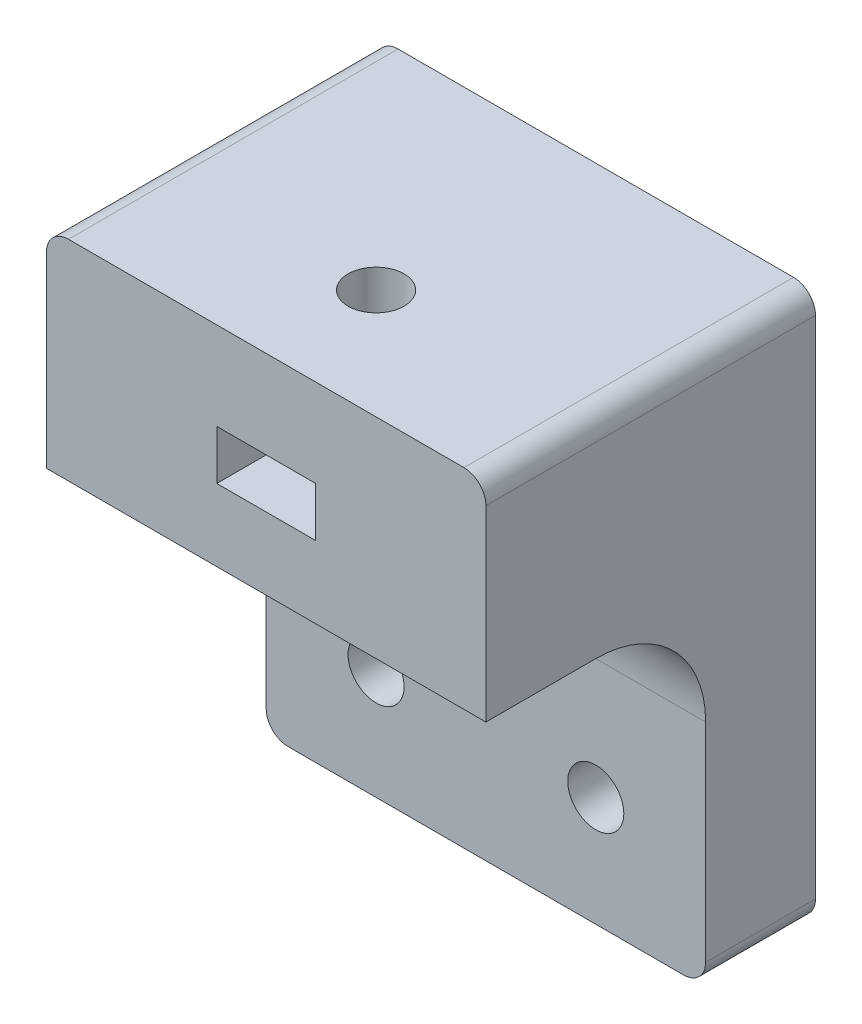
ISO-10303-21;
HEADER;
FILE_DESCRIPTION(('STEP AP214'),'2;1');
FILE_NAME('part.step','',(''),(''),'','','');
FILE_SCHEMA(('AUTOMOTIVE_DESIGN { 1 0 10303 214 1 1 1 1 }'));
ENDSEC;
DATA;
#1=APPLICATION_CONTEXT('core data for automotive mechanical design processes');
#2=APPLICATION_PROTOCOL_DEFINITION('international standard','automotive_design',2000,#1);
#3=PRODUCT_CONTEXT('',#1,'mechanical');
#4=PRODUCT('Part','Part','',(#3));
#5=PRODUCT_RELATED_PRODUCT_CATEGORY('part','',(#4));
#6=PRODUCT_DEFINITION_FORMATION('','',#4);
#7=PRODUCT_DEFINITION_CONTEXT('part definition',#1,'design');
#8=PRODUCT_DEFINITION('design','',#6,#7);
#9=PRODUCT_DEFINITION_SHAPE('','',#8);
#10=(LENGTH_UNIT() NAMED_UNIT(*) SI_UNIT(.MILLI.,.METRE.));
#11=(NAMED_UNIT(*) PLANE_ANGLE_UNIT() SI_UNIT($,.RADIAN.));
#12=(NAMED_UNIT(*) SI_UNIT($,.STERADIAN.) SOLID_ANGLE_UNIT());
#13=UNCERTAINTY_MEASURE_WITH_UNIT(LENGTH_MEASURE(1.E-05),#10,'distance_accuracy_value','');
#14=(GEOMETRIC_REPRESENTATION_CONTEXT(3) GLOBAL_UNCERTAINTY_ASSIGNED_CONTEXT((#13)) GLOBAL_UNIT_ASSIGNED_CONTEXT((#10,
#11,#12)) REPRESENTATION_CONTEXT('',''));
#15=CARTESIAN_POINT('',(0.,0.,0.));
#16=DIRECTION('',(0.,0.,1.));
#17=DIRECTION('',(1.,0.,0.));
#18=AXIS2_PLACEMENT_3D('',#15,#16,#17);
#19=CARTESIAN_POINT('',(5.13513513513512,0.,3.24324324324328));
#20=DIRECTION('',(0.,1.,0.));
#21=DIRECTION('',(0.,0.,1.));
#22=AXIS2_PLACEMENT_3D('',#19,#20,#21);
#23=CYLINDRICAL_SURFACE('',#22,2.55);
#24=CARTESIAN_POINT('',(5.13513513513512,42.,3.24324324324328));
#25=DIRECTION('',(0.,1.,0.));
#26=DIRECTION('',(0.,0.,1.));
#27=AXIS2_PLACEMENT_3D('',#24,#25,#26);
#28=CIRCLE('',#27,2.55);
#29=CARTESIAN_POINT('',(5.13513513513512,42.,5.79324324324328));
#30=VERTEX_POINT('',#29);
#31=EDGE_CURVE('E220',#30,#30,#28,.F.);
#32=ORIENTED_EDGE('',*,*,#31,.T.);
#33=EDGE_LOOP('',(#32));
#34=FACE_BOUND('',#33,.T.);
#35=CARTESIAN_POINT('',(5.13513513513512,50.,3.24324324324328));
#36=DIRECTION('',(0.,1.,0.));
#37=DIRECTION('',(0.,0.,1.));
#38=AXIS2_PLACEMENT_3D('',#35,#36,#37);
#39=CIRCLE('',#38,2.55);
#40=CARTESIAN_POINT('',(5.13513513513512,50.,5.79324324324328));
#41=VERTEX_POINT('',#40);
#42=EDGE_CURVE('E216',#41,#41,#39,.T.);
#43=ORIENTED_EDGE('',*,*,#42,.T.);
#44=EDGE_LOOP('',(#43));
#45=FACE_BOUND('',#44,.T.);
#46=ADVANCED_FACE('F35',(#34,#45),#23,.F.);
#47=CARTESIAN_POINT('',(15.1351351351351,10.,-16.7567567567567));
#48=DIRECTION('',(0.,0.,1.));
#49=DIRECTION('',(1.,0.,0.));
#50=AXIS2_PLACEMENT_3D('',#47,#48,#49);
#51=CYLINDRICAL_SURFACE('',#50,2.55);
#52=CARTESIAN_POINT('',(15.1351351351351,10.,-16.7567567567567));
#53=DIRECTION('',(0.,0.,1.));
#54=DIRECTION('',(1.,0.,0.));
#55=AXIS2_PLACEMENT_3D('',#52,#53,#54);
#56=CIRCLE('',#55,2.55);
#57=CARTESIAN_POINT('',(17.6851351351351,10.,-16.7567567567567));
#58=VERTEX_POINT('',#57);
#59=EDGE_CURVE('E225',#58,#58,#56,.T.);
#60=ORIENTED_EDGE('',*,*,#59,.F.);
#61=EDGE_LOOP('',(#60));
#62=FACE_BOUND('',#61,.T.);
#63=CARTESIAN_POINT('',(15.1351351351351,10.,-6.75675675675672));
#64=DIRECTION('',(0.,0.,1.));
#65=DIRECTION('',(1.,0.,0.));
#66=AXIS2_PLACEMENT_3D('',#63,#64,#65);
#67=CIRCLE('',#66,2.55);
#68=CARTESIAN_POINT('',(17.6851351351351,10.,-6.75675675675672));
#69=VERTEX_POINT('',#68);
#70=EDGE_CURVE('E228',#69,#69,#67,.F.);
#71=ORIENTED_EDGE('',*,*,#70,.F.);
#72=EDGE_LOOP('',(#71));
#73=FACE_BOUND('',#72,.T.);
#74=ADVANCED_FACE('F298',(#62,#73),#51,.F.);
#75=CARTESIAN_POINT('',(-4.86486486486488,10.,-16.7567567567567));
#76=DIRECTION('',(0.,0.,1.));
#77=DIRECTION('',(1.,0.,0.));
#78=AXIS2_PLACEMENT_3D('',#75,#76,#77);
#79=CYLINDRICAL_SURFACE('',#78,2.55);
#80=CARTESIAN_POINT('',(-4.86486486486488,10.,-16.7567567567567));
#81=DIRECTION('',(0.,0.,1.));
#82=DIRECTION('',(1.,0.,0.));
#83=AXIS2_PLACEMENT_3D('',#80,#81,#82);
#84=CIRCLE('',#83,2.55);
#85=CARTESIAN_POINT('',(-2.31486486486488,10.,-16.7567567567567));
#86=VERTEX_POINT('',#85);
#87=EDGE_CURVE('E221',#86,#86,#84,.T.);
#88=ORIENTED_EDGE('',*,*,#87,.F.);
#89=EDGE_LOOP('',(#88));
#90=FACE_BOUND('',#89,.T.);
#91=CARTESIAN_POINT('',(-4.86486486486488,10.,-6.75675675675672));
#92=DIRECTION('',(0.,0.,1.));
#93=DIRECTION('',(1.,0.,0.));
#94=AXIS2_PLACEMENT_3D('',#91,#92,#93);
#95=CIRCLE('',#94,2.55);
#96=CARTESIAN_POINT('',(-2.31486486486488,10.,-6.75675675675672));
#97=VERTEX_POINT('',#96);
#98=EDGE_CURVE('E219',#97,#97,#95,.F.);
#99=ORIENTED_EDGE('',*,*,#98,.F.);
#100=EDGE_LOOP('',(#99));
#101=FACE_BOUND('',#100,.T.);
#102=ADVANCED_FACE('F303',(#90,#101),#79,.F.);
#103=CARTESIAN_POINT('',(-14.8648648648649,50.,-16.7567567567567));
#104=DIRECTION('',(1.,0.,0.));
#105=DIRECTION('',(0.,0.,-1.));
#106=AXIS2_PLACEMENT_3D('',#103,#104,#105);
#107=PLANE('',#106);
#108=DIRECTION('',(0.,-1.,0.));
#109=VECTOR('',#108,1.);
#110=CARTESIAN_POINT('',(-14.8648648648649,50.,13.2432432432433));
#111=LINE('',#110,#109);
#112=CARTESIAN_POINT('',(-14.8648648648649,48.,13.2432432432433));
#113=VERTEX_POINT('',#112);
#114=CARTESIAN_POINT('',(-14.8648648648649,30.9412165982362,13.2432432432433));
#115=VERTEX_POINT('',#114);
#116=EDGE_CURVE('E157',#113,#115,#111,.T.);
#117=ORIENTED_EDGE('',*,*,#116,.F.);
#118=DIRECTION('',(0.,0.,1.));
#119=VECTOR('',#118,1.);
#120=CARTESIAN_POINT('',(-14.8648648648649,48.,-16.7567567567567));
#121=LINE('',#120,#119);
#122=CARTESIAN_POINT('',(-14.8648648648649,48.,-16.7567567567567));
#123=VERTEX_POINT('',#122);
#124=EDGE_CURVE('E11',#113,#123,#121,.F.);
#125=ORIENTED_EDGE('',*,*,#124,.T.);
#126=DIRECTION('',(0.,-1.,0.));
#127=VECTOR('',#126,1.);
#128=CARTESIAN_POINT('',(-14.8648648648649,50.,-16.7567567567567));
#129=LINE('',#128,#127);
#130=CARTESIAN_POINT('',(-14.8648648648649,2.,-16.7567567567567));
#131=VERTEX_POINT('',#130);
#132=EDGE_CURVE('E234',#123,#131,#129,.T.);
#133=ORIENTED_EDGE('',*,*,#132,.T.);
#134=DIRECTION('',(0.,0.,1.));
#135=VECTOR('',#134,1.);
#136=CARTESIAN_POINT('',(-14.8648648648649,2.,-16.7567567567567));
#137=LINE('',#136,#135);
#138=CARTESIAN_POINT('',(-14.8648648648649,2.,-6.75675675675672));
#139=VERTEX_POINT('',#138);
#140=EDGE_CURVE('E43',#131,#139,#137,.T.);
#141=ORIENTED_EDGE('',*,*,#140,.T.);
#142=DIRECTION('',(0.,-1.,0.));
#143=VECTOR('',#142,1.);
#144=CARTESIAN_POINT('',(-14.8648648648649,0.,-6.75675675675672));
#145=LINE('',#144,#143);
#146=CARTESIAN_POINT('',(-14.8648648648649,20.9412165982362,-6.75675675675672));
#147=VERTEX_POINT('',#146);
#148=EDGE_CURVE('E173',#147,#139,#145,.T.);
#149=ORIENTED_EDGE('',*,*,#148,.F.);
#150=CARTESIAN_POINT('',(-14.8648648648649,20.9412165982362,3.24324324324328));
#151=DIRECTION('',(1.,0.,0.));
#152=DIRECTION('',(0.,0.,-1.));
#153=AXIS2_PLACEMENT_3D('',#150,#151,#152);
#154=CIRCLE('',#153,10.);
#155=CARTESIAN_POINT('',(-14.8648648648649,30.9412165982362,3.24324324324328));
#156=VERTEX_POINT('',#155);
#157=EDGE_CURVE('E258',#147,#156,#154,.T.);
#158=ORIENTED_EDGE('',*,*,#157,.T.);
#159=DIRECTION('',(0.,0.,1.));
#160=VECTOR('',#159,1.);
#161=CARTESIAN_POINT('',(-14.8648648648649,30.9412165982362,-6.75675675675672));
#162=LINE('',#161,#160);
#163=EDGE_CURVE('E168',#156,#115,#162,.T.);
#164=ORIENTED_EDGE('',*,*,#163,.T.);
#165=EDGE_LOOP('',(#117,#125,#133,#141,#149,#158,#164));
#166=FACE_BOUND('',#165,.T.);
#167=ADVANCED_FACE('F281',(#166),#107,.F.);
#168=CARTESIAN_POINT('',(-14.8648648648649,50.,13.2432432432433));
#169=DIRECTION('',(0.,0.,-1.));
#170=DIRECTION('',(-1.,0.,0.));
#171=AXIS2_PLACEMENT_3D('',#168,#169,#170);
#172=PLANE('',#171);
#173=DIRECTION('',(1.,0.,0.));
#174=VECTOR('',#173,1.);
#175=CARTESIAN_POINT('',(0.635135135135122,37.5,13.2432432432433));
#176=LINE('',#175,#174);
#177=CARTESIAN_POINT('',(0.635135135135122,37.5,13.2432432432433));
#178=VERTEX_POINT('',#177);
#179=CARTESIAN_POINT('',(9.63513513513512,37.5,13.2432432432433));
#180=VERTEX_POINT('',#179);
#181=EDGE_CURVE('E199',#178,#180,#176,.T.);
#182=ORIENTED_EDGE('',*,*,#181,.F.);
#183=DIRECTION('',(0.,-1.,0.));
#184=VECTOR('',#183,1.);
#185=CARTESIAN_POINT('',(0.635135135135122,42.,13.2432432432433));
#186=LINE('',#185,#184);
#187=CARTESIAN_POINT('',(0.635135135135122,42.,13.2432432432433));
#188=VERTEX_POINT('',#187);
#189=EDGE_CURVE('E197',#188,#178,#186,.T.);
#190=ORIENTED_EDGE('',*,*,#189,.F.);
#191=DIRECTION('',(-1.,0.,0.));
#192=VECTOR('',#191,1.);
#193=CARTESIAN_POINT('',(0.635135135135122,42.,13.2432432432433));
#194=LINE('',#193,#192);
#195=CARTESIAN_POINT('',(9.63513513513512,42.,13.2432432432433));
#196=VERTEX_POINT('',#195);
#197=EDGE_CURVE('E187',#196,#188,#194,.T.);
#198=ORIENTED_EDGE('',*,*,#197,.F.);
#199=DIRECTION('',(0.,1.,0.));
#200=VECTOR('',#199,1.);
#201=CARTESIAN_POINT('',(9.63513513513512,42.,13.2432432432433));
#202=LINE('',#201,#200);
#203=EDGE_CURVE('E202',#180,#196,#202,.T.);
#204=ORIENTED_EDGE('',*,*,#203,.F.);
#205=EDGE_LOOP('',(#182,#190,#198,#204));
#206=FACE_BOUND('',#205,.T.);
#207=DIRECTION('',(0.,-1.,0.));
#208=VECTOR('',#207,1.);
#209=CARTESIAN_POINT('',(25.1351351351351,50.,13.2432432432433));
#210=LINE('',#209,#208);
#211=CARTESIAN_POINT('',(25.1351351351351,48.,13.2432432432433));
#212=VERTEX_POINT('',#211);
#213=CARTESIAN_POINT('',(25.1351351351351,30.9412165982362,13.2432432432433));
#214=VERTEX_POINT('',#213);
#215=EDGE_CURVE('E146',#212,#214,#210,.T.);
#216=ORIENTED_EDGE('',*,*,#215,.F.);
#217=CARTESIAN_POINT('',(23.1351351351351,48.,13.2432432432433));
#218=DIRECTION('',(0.,0.,-1.));
#219=DIRECTION('',(-1.,0.,0.));
#220=AXIS2_PLACEMENT_3D('',#217,#218,#219);
#221=CIRCLE('',#220,2.);
#222=CARTESIAN_POINT('',(23.1351351351351,50.,13.2432432432433));
#223=VERTEX_POINT('',#222);
#224=EDGE_CURVE('E56',#212,#223,#221,.F.);
#225=ORIENTED_EDGE('',*,*,#224,.T.);
#226=DIRECTION('',(1.,0.,0.));
#227=VECTOR('',#226,1.);
#228=CARTESIAN_POINT('',(-14.8648648648649,50.,13.2432432432433));
#229=LINE('',#228,#227);
#230=CARTESIAN_POINT('',(-12.8648648648649,50.,13.2432432432433));
#231=VERTEX_POINT('',#230);
#232=EDGE_CURVE('E229',#231,#223,#229,.T.);
#233=ORIENTED_EDGE('',*,*,#232,.F.);
#234=CARTESIAN_POINT('',(-12.8648648648649,48.,13.2432432432433));
#235=DIRECTION('',(0.,0.,-1.));
#236=DIRECTION('',(-1.,0.,0.));
#237=AXIS2_PLACEMENT_3D('',#234,#235,#236);
#238=CIRCLE('',#237,2.);
#239=EDGE_CURVE('E50',#231,#113,#238,.F.);
#240=ORIENTED_EDGE('',*,*,#239,.T.);
#241=ORIENTED_EDGE('',*,*,#116,.T.);
#242=DIRECTION('',(-1.,0.,0.));
#243=VECTOR('',#242,1.);
#244=CARTESIAN_POINT('',(-14.8648648648649,30.9412165982362,13.2432432432433));
#245=LINE('',#244,#243);
#246=EDGE_CURVE('E164',#214,#115,#245,.T.);
#247=ORIENTED_EDGE('',*,*,#246,.F.);
#248=EDGE_LOOP('',(#216,#225,#233,#240,#241,#247));
#249=FACE_BOUND('',#248,.T.);
#250=ADVANCED_FACE('F171',(#206,#249),#172,.F.);
#251=CARTESIAN_POINT('',(25.1351351351351,50.,-16.7567567567567));
#252=DIRECTION('',(-1.,0.,0.));
#253=DIRECTION('',(0.,0.,1.));
#254=AXIS2_PLACEMENT_3D('',#251,#252,#253);
#255=PLANE('',#254);
#256=DIRECTION('',(0.,1.,0.));
#257=VECTOR('',#256,1.);
#258=CARTESIAN_POINT('',(25.1351351351351,0.,-6.75675675675672));
#259=LINE('',#258,#257);
#260=CARTESIAN_POINT('',(25.1351351351351,2.,-6.75675675675672));
#261=VERTEX_POINT('',#260);
#262=CARTESIAN_POINT('',(25.1351351351351,20.9412165982362,-6.75675675675672));
#263=VERTEX_POINT('',#262);
#264=EDGE_CURVE('E169',#261,#263,#259,.T.);
#265=ORIENTED_EDGE('',*,*,#264,.F.);
#266=DIRECTION('',(0.,0.,-1.));
#267=VECTOR('',#266,1.);
#268=CARTESIAN_POINT('',(25.1351351351351,2.,-16.7567567567567));
#269=LINE('',#268,#267);
#270=CARTESIAN_POINT('',(25.1351351351351,2.,-16.7567567567567));
#271=VERTEX_POINT('',#270);
#272=EDGE_CURVE('E508',#261,#271,#269,.T.);
#273=ORIENTED_EDGE('',*,*,#272,.T.);
#274=DIRECTION('',(0.,-1.,0.));
#275=VECTOR('',#274,1.);
#276=CARTESIAN_POINT('',(25.1351351351351,50.,-16.7567567567567));
#277=LINE('',#276,#275);
#278=CARTESIAN_POINT('',(25.1351351351351,48.,-16.7567567567567));
#279=VERTEX_POINT('',#278);
#280=EDGE_CURVE('E158',#279,#271,#277,.T.);
#281=ORIENTED_EDGE('',*,*,#280,.F.);
#282=DIRECTION('',(0.,0.,-1.));
#283=VECTOR('',#282,1.);
#284=CARTESIAN_POINT('',(25.1351351351351,48.,13.2432432432433));
#285=LINE('',#284,#283);
#286=EDGE_CURVE('E155',#279,#212,#285,.F.);
#287=ORIENTED_EDGE('',*,*,#286,.T.);
#288=ORIENTED_EDGE('',*,*,#215,.T.);
#289=DIRECTION('',(0.,0.,1.));
#290=VECTOR('',#289,1.);
#291=CARTESIAN_POINT('',(25.1351351351351,30.9412165982362,-6.75675675675672));
#292=LINE('',#291,#290);
#293=CARTESIAN_POINT('',(25.1351351351351,30.9412165982362,3.24324324324328));
#294=VERTEX_POINT('',#293);
#295=EDGE_CURVE('E151',#294,#214,#292,.T.);
#296=ORIENTED_EDGE('',*,*,#295,.F.);
#297=CARTESIAN_POINT('',(25.1351351351351,20.9412165982362,3.24324324324328));
#298=DIRECTION('',(-1.,0.,0.));
#299=DIRECTION('',(0.,0.,1.));
#300=AXIS2_PLACEMENT_3D('',#297,#298,#299);
#301=CIRCLE('',#300,10.);
#302=EDGE_CURVE('E268',#294,#263,#301,.T.);
#303=ORIENTED_EDGE('',*,*,#302,.T.);
#304=EDGE_LOOP('',(#265,#273,#281,#287,#288,#296,#303));
#305=FACE_BOUND('',#304,.T.);
#306=ADVANCED_FACE('F149',(#305),#255,.F.);
#307=CARTESIAN_POINT('',(-14.8648648648649,50.,-16.7567567567567));
#308=DIRECTION('',(0.,0.,1.));
#309=DIRECTION('',(1.,0.,0.));
#310=AXIS2_PLACEMENT_3D('',#307,#308,#309);
#311=PLANE('',#310);
#312=ORIENTED_EDGE('',*,*,#87,.T.);
#313=EDGE_LOOP('',(#312));
#314=FACE_BOUND('',#313,.T.);
#315=ORIENTED_EDGE('',*,*,#59,.T.);
#316=EDGE_LOOP('',(#315));
#317=FACE_BOUND('',#316,.T.);
#318=ORIENTED_EDGE('',*,*,#280,.T.);
#319=CARTESIAN_POINT('',(23.1351351351351,2.,-16.7567567567567));
#320=DIRECTION('',(0.,0.,1.));
#321=DIRECTION('',(1.,0.,0.));
#322=AXIS2_PLACEMENT_3D('',#319,#320,#321);
#323=CIRCLE('',#322,2.);
#324=CARTESIAN_POINT('',(23.1351351351351,0.,-16.7567567567567));
#325=VERTEX_POINT('',#324);
#326=EDGE_CURVE('E535',#271,#325,#323,.F.);
#327=ORIENTED_EDGE('',*,*,#326,.T.);
#328=DIRECTION('',(-1.,0.,0.));
#329=VECTOR('',#328,1.);
#330=CARTESIAN_POINT('',(-14.8648648648649,0.,-16.7567567567567));
#331=LINE('',#330,#329);
#332=CARTESIAN_POINT('',(-12.8648648648649,0.,-16.7567567567567));
#333=VERTEX_POINT('',#332);
#334=EDGE_CURVE('E224',#325,#333,#331,.T.);
#335=ORIENTED_EDGE('',*,*,#334,.T.);
#336=CARTESIAN_POINT('',(-12.8648648648649,2.,-16.7567567567567));
#337=DIRECTION('',(0.,0.,1.));
#338=DIRECTION('',(1.,0.,0.));
#339=AXIS2_PLACEMENT_3D('',#336,#337,#338);
#340=CIRCLE('',#339,2.);
#341=EDGE_CURVE('E533',#333,#131,#340,.F.);
#342=ORIENTED_EDGE('',*,*,#341,.T.);
#343=ORIENTED_EDGE('',*,*,#132,.F.);
#344=CARTESIAN_POINT('',(-12.8648648648649,48.,-16.7567567567567));
#345=DIRECTION('',(0.,0.,1.));
#346=DIRECTION('',(1.,0.,0.));
#347=AXIS2_PLACEMENT_3D('',#344,#345,#346);
#348=CIRCLE('',#347,2.);
#349=CARTESIAN_POINT('',(-12.8648648648649,50.,-16.7567567567567));
#350=VERTEX_POINT('',#349);
#351=EDGE_CURVE('E529',#123,#350,#348,.F.);
#352=ORIENTED_EDGE('',*,*,#351,.T.);
#353=DIRECTION('',(-1.,0.,0.));
#354=VECTOR('',#353,1.);
#355=CARTESIAN_POINT('',(-14.8648648648649,50.,-16.7567567567567));
#356=LINE('',#355,#354);
#357=CARTESIAN_POINT('',(23.1351351351351,50.,-16.7567567567567));
#358=VERTEX_POINT('',#357);
#359=EDGE_CURVE('E231',#358,#350,#356,.T.);
#360=ORIENTED_EDGE('',*,*,#359,.F.);
#361=CARTESIAN_POINT('',(23.1351351351351,48.,-16.7567567567567));
#362=DIRECTION('',(0.,0.,1.));
#363=DIRECTION('',(1.,0.,0.));
#364=AXIS2_PLACEMENT_3D('',#361,#362,#363);
#365=CIRCLE('',#364,2.);
#366=EDGE_CURVE('E532',#358,#279,#365,.F.);
#367=ORIENTED_EDGE('',*,*,#366,.T.);
#368=EDGE_LOOP('',(#318,#327,#335,#342,#343,#352,#360,#367));
#369=FACE_BOUND('',#368,.T.);
#370=ADVANCED_FACE('F406',(#314,#317,#369),#311,.F.);
#371=CARTESIAN_POINT('',(0.,50.,0.));
#372=DIRECTION('',(0.,1.,0.));
#373=DIRECTION('',(0.,0.,1.));
#374=AXIS2_PLACEMENT_3D('',#371,#372,#373);
#375=PLANE('',#374);
#376=ORIENTED_EDGE('',*,*,#42,.F.);
#377=EDGE_LOOP('',(#376));
#378=FACE_BOUND('',#377,.T.);
#379=ORIENTED_EDGE('',*,*,#232,.T.);
#380=DIRECTION('',(0.,0.,-1.));
#381=VECTOR('',#380,1.);
#382=CARTESIAN_POINT('',(23.1351351351351,50.,-16.7567567567567));
#383=LINE('',#382,#381);
#384=EDGE_CURVE('E512',#223,#358,#383,.T.);
#385=ORIENTED_EDGE('',*,*,#384,.T.);
#386=ORIENTED_EDGE('',*,*,#359,.T.);
#387=DIRECTION('',(0.,0.,1.));
#388=VECTOR('',#387,1.);
#389=CARTESIAN_POINT('',(-12.8648648648649,50.,13.2432432432433));
#390=LINE('',#389,#388);
#391=EDGE_CURVE('E509',#350,#231,#390,.T.);
#392=ORIENTED_EDGE('',*,*,#391,.T.);
#393=EDGE_LOOP('',(#379,#385,#386,#392));
#394=FACE_BOUND('',#393,.T.);
#395=ADVANCED_FACE('F395',(#378,#394),#375,.T.);
#396=CARTESIAN_POINT('',(0.,0.,0.));
#397=DIRECTION('',(0.,1.,0.));
#398=DIRECTION('',(0.,0.,1.));
#399=AXIS2_PLACEMENT_3D('',#396,#397,#398);
#400=PLANE('',#399);
#401=ORIENTED_EDGE('',*,*,#334,.F.);
#402=DIRECTION('',(0.,0.,-1.));
#403=VECTOR('',#402,1.);
#404=CARTESIAN_POINT('',(23.1351351351351,0.,0.));
#405=LINE('',#404,#403);
#406=CARTESIAN_POINT('',(23.1351351351351,0.,-6.75675675675672));
#407=VERTEX_POINT('',#406);
#408=EDGE_CURVE('E506',#325,#407,#405,.F.);
#409=ORIENTED_EDGE('',*,*,#408,.T.);
#410=DIRECTION('',(1.,0.,0.));
#411=VECTOR('',#410,1.);
#412=CARTESIAN_POINT('',(-14.8648648648649,0.,-6.75675675675672));
#413=LINE('',#412,#411);
#414=CARTESIAN_POINT('',(-12.8648648648649,0.,-6.75675675675672));
#415=VERTEX_POINT('',#414);
#416=EDGE_CURVE('E176',#415,#407,#413,.T.);
#417=ORIENTED_EDGE('',*,*,#416,.F.);
#418=DIRECTION('',(0.,0.,1.));
#419=VECTOR('',#418,1.);
#420=CARTESIAN_POINT('',(-12.8648648648649,0.,0.));
#421=LINE('',#420,#419);
#422=EDGE_CURVE('E541',#415,#333,#421,.F.);
#423=ORIENTED_EDGE('',*,*,#422,.T.);
#424=EDGE_LOOP('',(#401,#409,#417,#423));
#425=FACE_BOUND('',#424,.T.);
#426=ADVANCED_FACE('F318',(#425),#400,.F.);
#427=CARTESIAN_POINT('',(-4.86486486486488,10.,-6.75675675675672));
#428=DIRECTION('',(0.,0.,1.));
#429=DIRECTION('',(1.,0.,0.));
#430=AXIS2_PLACEMENT_3D('',#427,#428,#429);
#431=PLANE('',#430);
#432=ORIENTED_EDGE('',*,*,#98,.T.);
#433=EDGE_LOOP('',(#432));
#434=FACE_BOUND('',#433,.T.);
#435=ORIENTED_EDGE('',*,*,#70,.T.);
#436=EDGE_LOOP('',(#435));
#437=FACE_BOUND('',#436,.T.);
#438=ORIENTED_EDGE('',*,*,#416,.T.);
#439=CARTESIAN_POINT('',(23.1351351351351,2.,-6.75675675675672));
#440=DIRECTION('',(0.,0.,1.));
#441=DIRECTION('',(1.,0.,0.));
#442=AXIS2_PLACEMENT_3D('',#439,#440,#441);
#443=CIRCLE('',#442,2.);
#444=EDGE_CURVE('E501',#407,#261,#443,.T.);
#445=ORIENTED_EDGE('',*,*,#444,.T.);
#446=ORIENTED_EDGE('',*,*,#264,.T.);
#447=DIRECTION('',(-1.,0.,0.));
#448=VECTOR('',#447,1.);
#449=CARTESIAN_POINT('',(-4.86486486486488,20.9412165982362,-6.75675675675672));
#450=LINE('',#449,#448);
#451=EDGE_CURVE('E242',#263,#147,#450,.T.);
#452=ORIENTED_EDGE('',*,*,#451,.T.);
#453=ORIENTED_EDGE('',*,*,#148,.T.);
#454=CARTESIAN_POINT('',(-12.8648648648649,2.,-6.75675675675672));
#455=DIRECTION('',(0.,0.,1.));
#456=DIRECTION('',(1.,0.,0.));
#457=AXIS2_PLACEMENT_3D('',#454,#455,#456);
#458=CIRCLE('',#457,2.);
#459=EDGE_CURVE('E502',#139,#415,#458,.T.);
#460=ORIENTED_EDGE('',*,*,#459,.T.);
#461=EDGE_LOOP('',(#438,#445,#446,#452,#453,#460));
#462=FACE_BOUND('',#461,.T.);
#463=ADVANCED_FACE('F309',(#434,#437,#462),#431,.T.);
#464=CARTESIAN_POINT('',(5.13513513513512,30.9412165982362,3.24324324324328));
#465=DIRECTION('',(0.,1.,0.));
#466=DIRECTION('',(0.,0.,1.));
#467=AXIS2_PLACEMENT_3D('',#464,#465,#466);
#468=CIRCLE('',#467,2.55);
#469=CARTESIAN_POINT('',(7.68513513513512,30.9412165982362,3.24324324324328));
#470=VERTEX_POINT('',#469);
#471=CARTESIAN_POINT('',(2.58513513513512,30.9412165982362,3.24324324324328));
#472=VERTEX_POINT('',#471);
#473=EDGE_CURVE('E181',#470,#472,#468,.F.);
#474=ORIENTED_EDGE('',*,*,#473,.T.);
#475=CARTESIAN_POINT('',(2.58513513513512,30.9412165982362,3.24324324324328));
#476=CARTESIAN_POINT('',(2.58512700263374,30.9412236873219,3.17273394268378));
#477=CARTESIAN_POINT('',(2.58805946428707,30.9404710237478,3.10222934361587));
#478=CARTESIAN_POINT('',(2.59974248267378,30.9374987813278,2.96174590507627));
#479=CARTESIAN_POINT('',(2.60849211102831,30.9352794365543,2.89176698351208));
#480=CARTESIAN_POINT('',(2.63172380216898,30.9294320801289,2.75296349109241));
#481=CARTESIAN_POINT('',(2.64619468731038,30.925806815491,2.68413694052791));
#482=CARTESIAN_POINT('',(2.68073460508286,30.9172531252434,2.54800510498454));
#483=CARTESIAN_POINT('',(2.70080370188768,30.9123246846952,2.48069983745409));
#484=CARTESIAN_POINT('',(2.76918983972051,30.8957737520603,2.28177724567868));
#485=CARTESIAN_POINT('',(2.8257083591255,30.8823796276096,2.15301914447287));
#486=CARTESIAN_POINT('',(2.95885613299081,30.8522966748752,1.90685577632668));
#487=CARTESIAN_POINT('',(3.03549036409787,30.8356070315304,1.78945332863601));
#488=CARTESIAN_POINT('',(3.20842795117587,30.8003450432026,1.56677813744211));
#489=CARTESIAN_POINT('',(3.30507807083091,30.781742898578,1.46177894913664));
#490=CARTESIAN_POINT('',(3.51456526136151,30.7449471246241,1.26928828810819));
#491=CARTESIAN_POINT('',(3.62740540282937,30.7267535735472,1.18180014407771));
#492=CARTESIAN_POINT('',(3.86822451708625,30.6925326589586,1.02550703034774));
#493=CARTESIAN_POINT('',(3.99641125039329,30.6765432936112,0.957013070532134));
#494=CARTESIAN_POINT('',(4.26294686813571,30.6489803905717,0.842658685047171));
#495=CARTESIAN_POINT('',(4.40129353089029,30.6374058908855,0.796793327991758));
#496=CARTESIAN_POINT('',(4.68118945977789,30.6202906455631,0.729938069593229));
#497=CARTESIAN_POINT('',(4.82261248071909,30.6146295438752,0.7084511746334));
#498=CARTESIAN_POINT('',(5.10716368692684,30.609621980499,0.689414303359856));
#499=CARTESIAN_POINT('',(5.25029161803304,30.6102745890719,0.691860802684422));
#500=CARTESIAN_POINT('',(5.5303533704324,30.6177128919746,0.720226183806732));
#501=CARTESIAN_POINT('',(5.66735228518808,30.6243429852856,0.745549586275053));
#502=CARTESIAN_POINT('',(5.93508869589203,30.6427408099674,0.817998631471485));
#503=CARTESIAN_POINT('',(6.06582578637575,30.6545088735335,0.865125683925344));
#504=CARTESIAN_POINT('',(6.31891398139248,30.6819979087478,0.980345729329986));
#505=CARTESIAN_POINT('',(6.44116302815998,30.6977589523165,1.04865293480305));
#506=CARTESIAN_POINT('',(6.67267319039634,30.7314352880724,1.20414335283394));
#507=CARTESIAN_POINT('',(6.78193223699761,30.7493509225016,1.29132956595727));
#508=CARTESIAN_POINT('',(6.98776210040305,30.7859690603582,1.48516391700395));
#509=CARTESIAN_POINT('',(7.08386142357053,30.8046791553771,1.59231188335803));
#510=CARTESIAN_POINT('',(7.25684117187301,30.8403049721816,1.82145908027558));
#511=CARTESIAN_POINT('',(7.33371667105138,30.8572202334169,1.94346210544942));
#512=CARTESIAN_POINT('',(7.46625519185194,30.887443359824,2.19956456049689));
#513=CARTESIAN_POINT('',(7.52182742019992,30.900735716403,2.33371281773636));
#514=CARTESIAN_POINT('',(7.60942880278323,30.9220882623428,2.60978444700742));
#515=CARTESIAN_POINT('',(7.64149242049934,30.9301561087681,2.75169610838821));
#516=CARTESIAN_POINT('',(7.66922585317168,30.9371695730255,2.95290958368751));
#517=CARTESIAN_POINT('',(7.67519286187027,30.9386851294583,3.01085401312752));
#518=CARTESIAN_POINT('',(7.68314303778835,30.9407081320997,3.12693749807621));
#519=CARTESIAN_POINT('',(7.68513272654787,30.9412172285674,3.18507607815397));
#520=CARTESIAN_POINT('',(7.68513513513514,30.9412165982362,3.24324324324328));
#521=B_SPLINE_CURVE_WITH_KNOTS('',3,(#475,#476,#477,#478,#479,#480,#481,#482,#483,#484,#485,
#486,#487,#488,#489,#490,#491,#492,#493,#494,#495,#496,#497,#498,#499,#500,#501,#502,#503,#504,
#505,#506,#507,#508,#509,#510,#511,#512,#513,#514,#515,#516,#517,#518,#519,#520),.UNSPECIFIED.,
.F.,.F.,(4,2,2,2,2,2,2,2,2,2,2,2,2,2,2,2,2,2,2,2,2,2,4),(0.,0.211454802377901,0.422875866155934,
0.633885900761809,0.844898354329457,1.26652033848646,1.68824673080947,2.11800392938071,
2.54784274351796,2.98435212804038,3.42076634326803,3.8481140238949,4.27539877549825,
4.69187209885299,5.10837235325979,5.52923055595998,5.95015569759794,6.38354447780384,
6.81704419700776,7.25237145253725,7.68705923788169,7.8617543608302,8.03616280359095),.UNSPECIFIED.);
#522=EDGE_CURVE('E260',#472,#470,#521,.T.);
#523=ORIENTED_EDGE('',*,*,#522,.T.);
#524=EDGE_LOOP('',(#474,#523));
#525=FACE_BOUND('',#524,.T.);
#526=CARTESIAN_POINT('',(5.13513513513512,37.5,3.24324324324328));
#527=DIRECTION('',(0.,-1.,0.));
#528=DIRECTION('',(0.,0.,-1.));
#529=AXIS2_PLACEMENT_3D('',#526,#527,#528);
#530=CIRCLE('',#529,2.55);
#531=CARTESIAN_POINT('',(5.13513513513512,37.5,0.693243243243281));
#532=VERTEX_POINT('',#531);
#533=EDGE_CURVE('E209',#532,#532,#530,.F.);
#534=ORIENTED_EDGE('',*,*,#533,.T.);
#535=EDGE_LOOP('',(#534));
#536=FACE_BOUND('',#535,.T.);
#537=ADVANCED_FACE('F270',(#525,#536),#23,.F.);
#538=CARTESIAN_POINT('',(0.635135135135122,42.,-1.75675675675672));
#539=DIRECTION('',(0.,1.,0.));
#540=DIRECTION('',(0.,0.,1.));
#541=AXIS2_PLACEMENT_3D('',#538,#539,#540);
#542=PLANE('',#541);
#543=ORIENTED_EDGE('',*,*,#197,.T.);
#544=DIRECTION('',(0.,0.,1.));
#545=VECTOR('',#544,1.);
#546=CARTESIAN_POINT('',(0.635135135135122,42.,-1.75675675675672));
#547=LINE('',#546,#545);
#548=CARTESIAN_POINT('',(0.635135135135122,42.,-1.75675675675672));
#549=VERTEX_POINT('',#548);
#550=EDGE_CURVE('E207',#549,#188,#547,.T.);
#551=ORIENTED_EDGE('',*,*,#550,.F.);
#552=DIRECTION('',(-1.,0.,0.));
#553=VECTOR('',#552,1.);
#554=CARTESIAN_POINT('',(0.635135135135122,42.,-1.75675675675672));
#555=LINE('',#554,#553);
#556=CARTESIAN_POINT('',(9.63513513513512,42.,-1.75675675675672));
#557=VERTEX_POINT('',#556);
#558=EDGE_CURVE('E193',#557,#549,#555,.T.);
#559=ORIENTED_EDGE('',*,*,#558,.F.);
#560=DIRECTION('',(0.,0.,1.));
#561=VECTOR('',#560,1.);
#562=CARTESIAN_POINT('',(9.63513513513512,42.,-1.75675675675672));
#563=LINE('',#562,#561);
#564=EDGE_CURVE('E210',#557,#196,#563,.T.);
#565=ORIENTED_EDGE('',*,*,#564,.T.);
#566=EDGE_LOOP('',(#543,#551,#559,#565));
#567=FACE_BOUND('',#566,.T.);
#568=ORIENTED_EDGE('',*,*,#31,.F.);
#569=EDGE_LOOP('',(#568));
#570=FACE_BOUND('',#569,.T.);
#571=ADVANCED_FACE('F308',(#567,#570),#542,.F.);
#572=CARTESIAN_POINT('',(0.635135135135122,37.5,-1.75675675675672));
#573=DIRECTION('',(0.,-1.,0.));
#574=DIRECTION('',(0.,0.,-1.));
#575=AXIS2_PLACEMENT_3D('',#572,#573,#574);
#576=PLANE('',#575);
#577=ORIENTED_EDGE('',*,*,#181,.T.);
#578=DIRECTION('',(0.,0.,1.));
#579=VECTOR('',#578,1.);
#580=CARTESIAN_POINT('',(9.63513513513512,37.5,-1.75675675675672));
#581=LINE('',#580,#579);
#582=CARTESIAN_POINT('',(9.63513513513512,37.5,-1.75675675675672));
#583=VERTEX_POINT('',#582);
#584=EDGE_CURVE('E212',#583,#180,#581,.T.);
#585=ORIENTED_EDGE('',*,*,#584,.F.);
#586=DIRECTION('',(1.,0.,0.));
#587=VECTOR('',#586,1.);
#588=CARTESIAN_POINT('',(0.635135135135122,37.5,-1.75675675675672));
#589=LINE('',#588,#587);
#590=CARTESIAN_POINT('',(0.635135135135122,37.5,-1.75675675675672));
#591=VERTEX_POINT('',#590);
#592=EDGE_CURVE('E186',#591,#583,#589,.T.);
#593=ORIENTED_EDGE('',*,*,#592,.F.);
#594=DIRECTION('',(0.,0.,1.));
#595=VECTOR('',#594,1.);
#596=CARTESIAN_POINT('',(0.635135135135122,37.5,-1.75675675675672));
#597=LINE('',#596,#595);
#598=EDGE_CURVE('E196',#591,#178,#597,.T.);
#599=ORIENTED_EDGE('',*,*,#598,.T.);
#600=EDGE_LOOP('',(#577,#585,#593,#599));
#601=FACE_BOUND('',#600,.T.);
#602=ORIENTED_EDGE('',*,*,#533,.F.);
#603=EDGE_LOOP('',(#602));
#604=FACE_BOUND('',#603,.T.);
#605=ADVANCED_FACE('F315',(#601,#604),#576,.F.);
#606=CARTESIAN_POINT('',(0.635135135135122,42.,-1.75675675675672));
#607=DIRECTION('',(-1.,0.,0.));
#608=DIRECTION('',(0.,-1.,0.));
#609=AXIS2_PLACEMENT_3D('',#606,#607,#608);
#610=PLANE('',#609);
#611=ORIENTED_EDGE('',*,*,#189,.T.);
#612=ORIENTED_EDGE('',*,*,#598,.F.);
#613=DIRECTION('',(0.,-1.,0.));
#614=VECTOR('',#613,1.);
#615=CARTESIAN_POINT('',(0.635135135135122,42.,-1.75675675675672));
#616=LINE('',#615,#614);
#617=EDGE_CURVE('E183',#549,#591,#616,.T.);
#618=ORIENTED_EDGE('',*,*,#617,.F.);
#619=ORIENTED_EDGE('',*,*,#550,.T.);
#620=EDGE_LOOP('',(#611,#612,#618,#619));
#621=FACE_BOUND('',#620,.T.);
#622=ADVANCED_FACE('F325',(#621),#610,.F.);
#623=CARTESIAN_POINT('',(9.63513513513512,42.,-1.75675675675672));
#624=DIRECTION('',(1.,0.,0.));
#625=DIRECTION('',(0.,0.,-1.));
#626=AXIS2_PLACEMENT_3D('',#623,#624,#625);
#627=PLANE('',#626);
#628=ORIENTED_EDGE('',*,*,#203,.T.);
#629=ORIENTED_EDGE('',*,*,#564,.F.);
#630=DIRECTION('',(0.,1.,0.));
#631=VECTOR('',#630,1.);
#632=CARTESIAN_POINT('',(9.63513513513512,42.,-1.75675675675672));
#633=LINE('',#632,#631);
#634=EDGE_CURVE('E190',#583,#557,#633,.T.);
#635=ORIENTED_EDGE('',*,*,#634,.F.);
#636=ORIENTED_EDGE('',*,*,#584,.T.);
#637=EDGE_LOOP('',(#628,#629,#635,#636));
#638=FACE_BOUND('',#637,.T.);
#639=ADVANCED_FACE('F331',(#638),#627,.F.);
#640=CARTESIAN_POINT('',(0.,0.,-1.75675675675672));
#641=DIRECTION('',(0.,0.,1.));
#642=DIRECTION('',(1.,0.,0.));
#643=AXIS2_PLACEMENT_3D('',#640,#641,#642);
#644=PLANE('',#643);
#645=ORIENTED_EDGE('',*,*,#617,.T.);
#646=ORIENTED_EDGE('',*,*,#592,.T.);
#647=ORIENTED_EDGE('',*,*,#634,.T.);
#648=ORIENTED_EDGE('',*,*,#558,.T.);
#649=EDGE_LOOP('',(#645,#646,#647,#648));
#650=FACE_BOUND('',#649,.T.);
#651=ADVANCED_FACE('F335',(#650),#644,.T.);
#652=CARTESIAN_POINT('',(-14.8648648648649,30.9412165982362,-6.75675675675672));
#653=DIRECTION('',(0.,1.,0.));
#654=DIRECTION('',(0.,0.,1.));
#655=AXIS2_PLACEMENT_3D('',#652,#653,#654);
#656=PLANE('',#655);
#657=ORIENTED_EDGE('',*,*,#163,.F.);
#658=DIRECTION('',(-1.,0.,0.));
#659=VECTOR('',#658,1.);
#660=CARTESIAN_POINT('',(-14.8648648648649,30.9412165982362,3.24324324324328));
#661=LINE('',#660,#659);
#662=EDGE_CURVE('E256',#156,#472,#661,.F.);
#663=ORIENTED_EDGE('',*,*,#662,.T.);
#664=ORIENTED_EDGE('',*,*,#473,.F.);
#665=DIRECTION('',(-1.,0.,0.));
#666=VECTOR('',#665,1.);
#667=CARTESIAN_POINT('',(-14.8648648648649,30.9412165982362,3.24324324324328));
#668=LINE('',#667,#666);
#669=EDGE_CURVE('E167',#470,#294,#668,.F.);
#670=ORIENTED_EDGE('',*,*,#669,.T.);
#671=ORIENTED_EDGE('',*,*,#295,.T.);
#672=ORIENTED_EDGE('',*,*,#246,.T.);
#673=EDGE_LOOP('',(#657,#663,#664,#670,#671,#672));
#674=FACE_BOUND('',#673,.T.);
#675=ADVANCED_FACE('F163',(#674),#656,.F.);
#676=CARTESIAN_POINT('',(-4.86486486486488,20.9412165982362,3.24324324324328));
#677=DIRECTION('',(-1.,0.,0.));
#678=DIRECTION('',(0.,0.,1.));
#679=AXIS2_PLACEMENT_3D('',#676,#677,#678);
#680=CYLINDRICAL_SURFACE('',#679,10.);
#681=ORIENTED_EDGE('',*,*,#522,.F.);
#682=ORIENTED_EDGE('',*,*,#662,.F.);
#683=ORIENTED_EDGE('',*,*,#157,.F.);
#684=ORIENTED_EDGE('',*,*,#451,.F.);
#685=ORIENTED_EDGE('',*,*,#302,.F.);
#686=ORIENTED_EDGE('',*,*,#669,.F.);
#687=EDGE_LOOP('',(#681,#682,#683,#684,#685,#686));
#688=FACE_BOUND('',#687,.T.);
#689=ADVANCED_FACE('F274',(#688),#680,.F.);
#690=CARTESIAN_POINT('',(23.1351351351351,2.,-16.7567567567567));
#691=DIRECTION('',(0.,0.,-1.));
#692=DIRECTION('',(-1.,0.,0.));
#693=AXIS2_PLACEMENT_3D('',#690,#691,#692);
#694=CYLINDRICAL_SURFACE('',#693,2.);
#695=ORIENTED_EDGE('',*,*,#444,.F.);
#696=ORIENTED_EDGE('',*,*,#408,.F.);
#697=ORIENTED_EDGE('',*,*,#326,.F.);
#698=ORIENTED_EDGE('',*,*,#272,.F.);
#699=EDGE_LOOP('',(#695,#696,#697,#698));
#700=FACE_BOUND('',#699,.T.);
#701=ADVANCED_FACE('F279',(#700),#694,.T.);
#702=CARTESIAN_POINT('',(23.1351351351351,48.,0.));
#703=DIRECTION('',(0.,0.,1.));
#704=DIRECTION('',(1.,0.,0.));
#705=AXIS2_PLACEMENT_3D('',#702,#703,#704);
#706=CYLINDRICAL_SURFACE('',#705,2.);
#707=ORIENTED_EDGE('',*,*,#224,.F.);
#708=ORIENTED_EDGE('',*,*,#286,.F.);
#709=ORIENTED_EDGE('',*,*,#366,.F.);
#710=ORIENTED_EDGE('',*,*,#384,.F.);
#711=EDGE_LOOP('',(#707,#708,#709,#710));
#712=FACE_BOUND('',#711,.T.);
#713=ADVANCED_FACE('F285',(#712),#706,.T.);
#714=CARTESIAN_POINT('',(-12.8648648648649,48.,0.));
#715=DIRECTION('',(0.,0.,-1.));
#716=DIRECTION('',(-1.,0.,0.));
#717=AXIS2_PLACEMENT_3D('',#714,#715,#716);
#718=CYLINDRICAL_SURFACE('',#717,2.);
#719=ORIENTED_EDGE('',*,*,#351,.F.);
#720=ORIENTED_EDGE('',*,*,#124,.F.);
#721=ORIENTED_EDGE('',*,*,#239,.F.);
#722=ORIENTED_EDGE('',*,*,#391,.F.);
#723=EDGE_LOOP('',(#719,#720,#721,#722));
#724=FACE_BOUND('',#723,.T.);
#725=ADVANCED_FACE('F288',(#724),#718,.T.);
#726=CARTESIAN_POINT('',(-12.8648648648649,2.,-16.7567567567567));
#727=DIRECTION('',(0.,0.,1.));
#728=DIRECTION('',(1.,0.,0.));
#729=AXIS2_PLACEMENT_3D('',#726,#727,#728);
#730=CYLINDRICAL_SURFACE('',#729,2.);
#731=ORIENTED_EDGE('',*,*,#341,.F.);
#732=ORIENTED_EDGE('',*,*,#422,.F.);
#733=ORIENTED_EDGE('',*,*,#459,.F.);
#734=ORIENTED_EDGE('',*,*,#140,.F.);
#735=EDGE_LOOP('',(#731,#732,#733,#734));
#736=FACE_BOUND('',#735,.T.);
#737=ADVANCED_FACE('F37',(#736),#730,.T.);
#738=CLOSED_SHELL('',(#46,#74,#102,#167,#250,#306,#370,#395,#426,#463,#537,#571,#605,#622,#639,
#651,#675,#689,#701,#713,#725,#737));
#739=MANIFOLD_SOLID_BREP('B2',#738);
#740=ADVANCED_BREP_SHAPE_REPRESENTATION('',(#18,#739),#14);
#741=SHAPE_DEFINITION_REPRESENTATION(#9,#740);
ENDSEC;
END-ISO-10303-21;
